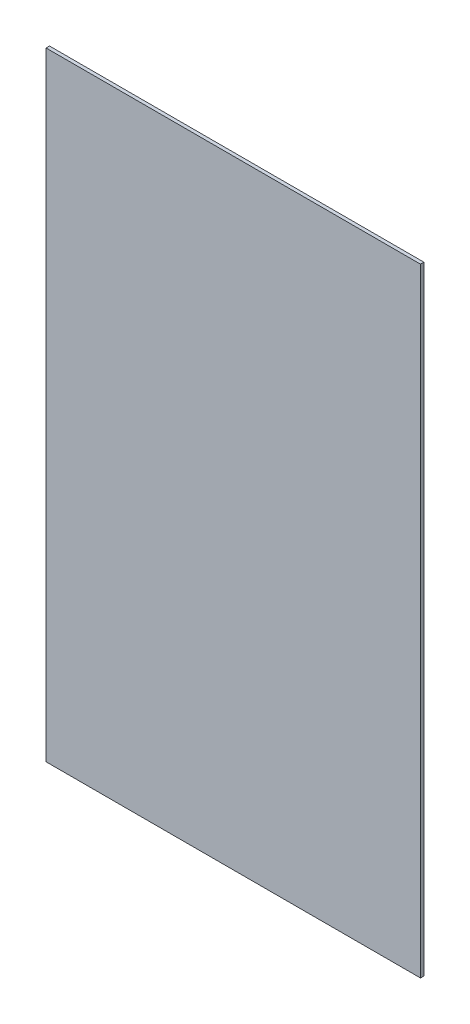
ISO-10303-21;
HEADER;
FILE_DESCRIPTION(('STEP AP214'),'2;1');
FILE_NAME('part.step','',(''),(''),'','','');
FILE_SCHEMA(('AUTOMOTIVE_DESIGN { 1 0 10303 214 1 1 1 1 }'));
ENDSEC;
DATA;
#1=APPLICATION_CONTEXT('core data for automotive mechanical design processes');
#2=APPLICATION_PROTOCOL_DEFINITION('international standard','automotive_design',2000,#1);
#3=PRODUCT_CONTEXT('',#1,'mechanical');
#4=PRODUCT('Part','Part','',(#3));
#5=PRODUCT_RELATED_PRODUCT_CATEGORY('part','',(#4));
#6=PRODUCT_DEFINITION_FORMATION('','',#4);
#7=PRODUCT_DEFINITION_CONTEXT('part definition',#1,'design');
#8=PRODUCT_DEFINITION('design','',#6,#7);
#9=PRODUCT_DEFINITION_SHAPE('','',#8);
#10=(LENGTH_UNIT() NAMED_UNIT(*) SI_UNIT(.MILLI.,.METRE.));
#11=(NAMED_UNIT(*) PLANE_ANGLE_UNIT() SI_UNIT($,.RADIAN.));
#12=(NAMED_UNIT(*) SI_UNIT($,.STERADIAN.) SOLID_ANGLE_UNIT());
#13=UNCERTAINTY_MEASURE_WITH_UNIT(LENGTH_MEASURE(1.E-05),#10,'distance_accuracy_value','');
#14=(GEOMETRIC_REPRESENTATION_CONTEXT(3) GLOBAL_UNCERTAINTY_ASSIGNED_CONTEXT((#13)) GLOBAL_UNIT_ASSIGNED_CONTEXT((#10,
#11,#12)) REPRESENTATION_CONTEXT('',''));
#15=CARTESIAN_POINT('',(0.,0.,0.));
#16=DIRECTION('',(0.,0.,1.));
#17=DIRECTION('',(1.,0.,0.));
#18=AXIS2_PLACEMENT_3D('',#15,#16,#17);
#19=CARTESIAN_POINT('',(0.,0.,3.175));
#20=DIRECTION('',(1.,0.,0.));
#21=DIRECTION('',(0.,0.,-1.));
#22=AXIS2_PLACEMENT_3D('',#19,#20,#21);
#23=PLANE('',#22);
#24=DIRECTION('',(0.,-1.,0.));
#25=VECTOR('',#24,1.);
#26=CARTESIAN_POINT('',(0.,0.,0.));
#27=LINE('',#26,#25);
#28=CARTESIAN_POINT('',(0.,571.5,0.));
#29=VERTEX_POINT('',#28);
#30=CARTESIAN_POINT('',(0.,0.,0.));
#31=VERTEX_POINT('',#30);
#32=EDGE_CURVE('E100',#29,#31,#27,.T.);
#33=ORIENTED_EDGE('',*,*,#32,.T.);
#34=DIRECTION('',(0.,0.,-1.));
#35=VECTOR('',#34,1.);
#36=CARTESIAN_POINT('',(0.,0.,3.175));
#37=LINE('',#36,#35);
#38=CARTESIAN_POINT('',(0.,0.,3.175));
#39=VERTEX_POINT('',#38);
#40=EDGE_CURVE('E11',#39,#31,#37,.T.);
#41=ORIENTED_EDGE('',*,*,#40,.F.);
#42=DIRECTION('',(0.,-1.,0.));
#43=VECTOR('',#42,1.);
#44=CARTESIAN_POINT('',(0.,0.,3.175));
#45=LINE('',#44,#43);
#46=CARTESIAN_POINT('',(0.,571.5,3.175));
#47=VERTEX_POINT('',#46);
#48=EDGE_CURVE('E88',#47,#39,#45,.T.);
#49=ORIENTED_EDGE('',*,*,#48,.F.);
#50=DIRECTION('',(0.,0.,-1.));
#51=VECTOR('',#50,1.);
#52=CARTESIAN_POINT('',(0.,571.5,3.175));
#53=LINE('',#52,#51);
#54=EDGE_CURVE('E96',#47,#29,#53,.T.);
#55=ORIENTED_EDGE('',*,*,#54,.T.);
#56=EDGE_LOOP('',(#33,#41,#49,#55));
#57=FACE_BOUND('',#56,.T.);
#58=ADVANCED_FACE('F37',(#57),#23,.F.);
#59=CARTESIAN_POINT('',(0.,0.,3.175));
#60=DIRECTION('',(0.,1.,0.));
#61=DIRECTION('',(0.,0.,1.));
#62=AXIS2_PLACEMENT_3D('',#59,#60,#61);
#63=PLANE('',#62);
#64=DIRECTION('',(1.,0.,0.));
#65=VECTOR('',#64,1.);
#66=CARTESIAN_POINT('',(0.,0.,0.));
#67=LINE('',#66,#65);
#68=CARTESIAN_POINT('',(346.141930826985,0.,0.));
#69=VERTEX_POINT('',#68);
#70=EDGE_CURVE('E92',#31,#69,#67,.T.);
#71=ORIENTED_EDGE('',*,*,#70,.T.);
#72=DIRECTION('',(0.,0.,-1.));
#73=VECTOR('',#72,1.);
#74=CARTESIAN_POINT('',(346.141930826985,0.,3.175));
#75=LINE('',#74,#73);
#76=CARTESIAN_POINT('',(346.141930826985,0.,3.175));
#77=VERTEX_POINT('',#76);
#78=EDGE_CURVE('E45',#77,#69,#75,.T.);
#79=ORIENTED_EDGE('',*,*,#78,.F.);
#80=DIRECTION('',(1.,0.,0.));
#81=VECTOR('',#80,1.);
#82=CARTESIAN_POINT('',(0.,0.,3.175));
#83=LINE('',#82,#81);
#84=EDGE_CURVE('E83',#39,#77,#83,.T.);
#85=ORIENTED_EDGE('',*,*,#84,.F.);
#86=ORIENTED_EDGE('',*,*,#40,.T.);
#87=EDGE_LOOP('',(#71,#79,#85,#86));
#88=FACE_BOUND('',#87,.T.);
#89=ADVANCED_FACE('F91',(#88),#63,.F.);
#90=CARTESIAN_POINT('',(346.141930826985,0.,3.175));
#91=DIRECTION('',(-1.,0.,0.));
#92=DIRECTION('',(0.,0.,1.));
#93=AXIS2_PLACEMENT_3D('',#90,#91,#92);
#94=PLANE('',#93);
#95=DIRECTION('',(0.,1.,0.));
#96=VECTOR('',#95,1.);
#97=CARTESIAN_POINT('',(346.141930826985,0.,0.));
#98=LINE('',#97,#96);
#99=CARTESIAN_POINT('',(346.141930826985,571.5,0.));
#100=VERTEX_POINT('',#99);
#101=EDGE_CURVE('E70',#69,#100,#98,.T.);
#102=ORIENTED_EDGE('',*,*,#101,.T.);
#103=DIRECTION('',(0.,0.,-1.));
#104=VECTOR('',#103,1.);
#105=CARTESIAN_POINT('',(346.141930826985,571.5,3.175));
#106=LINE('',#105,#104);
#107=CARTESIAN_POINT('',(346.141930826985,571.5,3.175));
#108=VERTEX_POINT('',#107);
#109=EDGE_CURVE('E93',#108,#100,#106,.T.);
#110=ORIENTED_EDGE('',*,*,#109,.F.);
#111=DIRECTION('',(0.,1.,0.));
#112=VECTOR('',#111,1.);
#113=CARTESIAN_POINT('',(346.141930826985,0.,3.175));
#114=LINE('',#113,#112);
#115=EDGE_CURVE('E86',#77,#108,#114,.T.);
#116=ORIENTED_EDGE('',*,*,#115,.F.);
#117=ORIENTED_EDGE('',*,*,#78,.T.);
#118=EDGE_LOOP('',(#102,#110,#116,#117));
#119=FACE_BOUND('',#118,.T.);
#120=ADVANCED_FACE('F94',(#119),#94,.F.);
#121=CARTESIAN_POINT('',(0.,571.5,3.175));
#122=DIRECTION('',(0.,-1.,0.));
#123=DIRECTION('',(0.,0.,-1.));
#124=AXIS2_PLACEMENT_3D('',#121,#122,#123);
#125=PLANE('',#124);
#126=DIRECTION('',(-1.,0.,0.));
#127=VECTOR('',#126,1.);
#128=CARTESIAN_POINT('',(0.,571.5,0.));
#129=LINE('',#128,#127);
#130=EDGE_CURVE('E76',#100,#29,#129,.T.);
#131=ORIENTED_EDGE('',*,*,#130,.T.);
#132=ORIENTED_EDGE('',*,*,#54,.F.);
#133=DIRECTION('',(-1.,0.,0.));
#134=VECTOR('',#133,1.);
#135=CARTESIAN_POINT('',(0.,571.5,3.175));
#136=LINE('',#135,#134);
#137=EDGE_CURVE('E53',#108,#47,#136,.T.);
#138=ORIENTED_EDGE('',*,*,#137,.F.);
#139=ORIENTED_EDGE('',*,*,#109,.T.);
#140=EDGE_LOOP('',(#131,#132,#138,#139));
#141=FACE_BOUND('',#140,.T.);
#142=ADVANCED_FACE('F107',(#141),#125,.F.);
#143=CARTESIAN_POINT('',(0.,0.,3.175));
#144=DIRECTION('',(0.,0.,-1.));
#145=DIRECTION('',(-1.,0.,0.));
#146=AXIS2_PLACEMENT_3D('',#143,#144,#145);
#147=PLANE('',#146);
#148=ORIENTED_EDGE('',*,*,#48,.T.);
#149=ORIENTED_EDGE('',*,*,#84,.T.);
#150=ORIENTED_EDGE('',*,*,#115,.T.);
#151=ORIENTED_EDGE('',*,*,#137,.T.);
#152=EDGE_LOOP('',(#148,#149,#150,#151));
#153=FACE_BOUND('',#152,.T.);
#154=ADVANCED_FACE('F84',(#153),#147,.F.);
#155=CARTESIAN_POINT('',(0.,0.,0.));
#156=DIRECTION('',(0.,0.,-1.));
#157=DIRECTION('',(-1.,0.,0.));
#158=AXIS2_PLACEMENT_3D('',#155,#156,#157);
#159=PLANE('',#158);
#160=ORIENTED_EDGE('',*,*,#32,.F.);
#161=ORIENTED_EDGE('',*,*,#130,.F.);
#162=ORIENTED_EDGE('',*,*,#101,.F.);
#163=ORIENTED_EDGE('',*,*,#70,.F.);
#164=EDGE_LOOP('',(#160,#161,#162,#163));
#165=FACE_BOUND('',#164,.T.);
#166=ADVANCED_FACE('F110',(#165),#159,.T.);
#167=CLOSED_SHELL('',(#58,#89,#120,#142,#154,#166));
#168=MANIFOLD_SOLID_BREP('B2',#167);
#169=ADVANCED_BREP_SHAPE_REPRESENTATION('',(#18,#168),#14);
#170=SHAPE_DEFINITION_REPRESENTATION(#9,#169);
ENDSEC;
END-ISO-10303-21;
